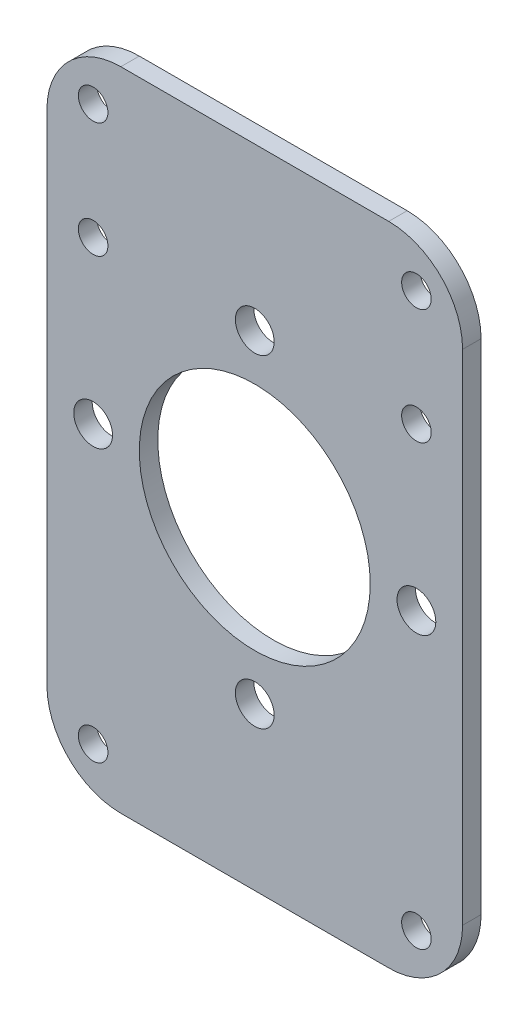
ISO-10303-21;
HEADER;
FILE_DESCRIPTION(('STEP AP214'),'2;1');
FILE_NAME('part.step','',(''),(''),'','','');
FILE_SCHEMA(('AUTOMOTIVE_DESIGN { 1 0 10303 214 1 1 1 1 }'));
ENDSEC;
DATA;
#1=APPLICATION_CONTEXT('core data for automotive mechanical design processes');
#2=APPLICATION_PROTOCOL_DEFINITION('international standard','automotive_design',2000,#1);
#3=PRODUCT_CONTEXT('',#1,'mechanical');
#4=PRODUCT('Part','Part','',(#3));
#5=PRODUCT_RELATED_PRODUCT_CATEGORY('part','',(#4));
#6=PRODUCT_DEFINITION_FORMATION('','',#4);
#7=PRODUCT_DEFINITION_CONTEXT('part definition',#1,'design');
#8=PRODUCT_DEFINITION('design','',#6,#7);
#9=PRODUCT_DEFINITION_SHAPE('','',#8);
#10=(LENGTH_UNIT() NAMED_UNIT(*) SI_UNIT(.MILLI.,.METRE.));
#11=(NAMED_UNIT(*) PLANE_ANGLE_UNIT() SI_UNIT($,.RADIAN.));
#12=(NAMED_UNIT(*) SI_UNIT($,.STERADIAN.) SOLID_ANGLE_UNIT());
#13=UNCERTAINTY_MEASURE_WITH_UNIT(LENGTH_MEASURE(1.E-05),#10,'distance_accuracy_value','');
#14=(GEOMETRIC_REPRESENTATION_CONTEXT(3) GLOBAL_UNCERTAINTY_ASSIGNED_CONTEXT((#13)) GLOBAL_UNIT_ASSIGNED_CONTEXT((#10,
#11,#12)) REPRESENTATION_CONTEXT('',''));
#15=CARTESIAN_POINT('',(0.,0.,0.));
#16=DIRECTION('',(0.,0.,1.));
#17=DIRECTION('',(1.,0.,0.));
#18=AXIS2_PLACEMENT_3D('',#15,#16,#17);
#19=CARTESIAN_POINT('',(0.,0.,2.));
#20=DIRECTION('',(0.,0.,1.));
#21=DIRECTION('',(1.,0.,0.));
#22=AXIS2_PLACEMENT_3D('',#19,#20,#21);
#23=PLANE('',#22);
#24=CARTESIAN_POINT('',(-17.5,-30.,2.));
#25=DIRECTION('',(0.,0.,1.));
#26=DIRECTION('',(1.,0.,0.));
#27=AXIS2_PLACEMENT_3D('',#24,#25,#26);
#28=CIRCLE('',#27,1.6);
#29=CARTESIAN_POINT('',(-15.9,-30.,2.));
#30=VERTEX_POINT('',#29);
#31=EDGE_CURVE('E228',#30,#30,#28,.T.);
#32=ORIENTED_EDGE('',*,*,#31,.F.);
#33=EDGE_LOOP('',(#32));
#34=FACE_BOUND('',#33,.T.);
#35=CARTESIAN_POINT('',(-17.5,30.,2.));
#36=DIRECTION('',(0.,0.,1.));
#37=DIRECTION('',(1.,0.,0.));
#38=AXIS2_PLACEMENT_3D('',#35,#36,#37);
#39=CIRCLE('',#38,1.6);
#40=CARTESIAN_POINT('',(-15.9,30.,2.));
#41=VERTEX_POINT('',#40);
#42=EDGE_CURVE('E216',#41,#41,#39,.T.);
#43=ORIENTED_EDGE('',*,*,#42,.F.);
#44=EDGE_LOOP('',(#43));
#45=FACE_BOUND('',#44,.T.);
#46=CARTESIAN_POINT('',(-17.5,17.5,2.));
#47=DIRECTION('',(0.,0.,1.));
#48=DIRECTION('',(1.,0.,0.));
#49=AXIS2_PLACEMENT_3D('',#46,#47,#48);
#50=CIRCLE('',#49,1.6);
#51=CARTESIAN_POINT('',(-15.9,17.5,2.));
#52=VERTEX_POINT('',#51);
#53=EDGE_CURVE('E204',#52,#52,#50,.T.);
#54=ORIENTED_EDGE('',*,*,#53,.F.);
#55=EDGE_LOOP('',(#54));
#56=FACE_BOUND('',#55,.T.);
#57=CARTESIAN_POINT('',(0.,-17.5,2.));
#58=DIRECTION('',(0.,0.,1.));
#59=DIRECTION('',(1.,0.,0.));
#60=AXIS2_PLACEMENT_3D('',#57,#58,#59);
#61=CIRCLE('',#60,2.1);
#62=CARTESIAN_POINT('',(2.1,-17.5,2.));
#63=VERTEX_POINT('',#62);
#64=EDGE_CURVE('E192',#63,#63,#61,.T.);
#65=ORIENTED_EDGE('',*,*,#64,.F.);
#66=EDGE_LOOP('',(#65));
#67=FACE_BOUND('',#66,.T.);
#68=CARTESIAN_POINT('',(-17.5,0.,2.));
#69=DIRECTION('',(0.,0.,1.));
#70=DIRECTION('',(1.,0.,0.));
#71=AXIS2_PLACEMENT_3D('',#68,#69,#70);
#72=CIRCLE('',#71,2.1);
#73=CARTESIAN_POINT('',(-15.4,0.,2.));
#74=VERTEX_POINT('',#73);
#75=EDGE_CURVE('E180',#74,#74,#72,.T.);
#76=ORIENTED_EDGE('',*,*,#75,.F.);
#77=EDGE_LOOP('',(#76));
#78=FACE_BOUND('',#77,.T.);
#79=DIRECTION('',(0.,-1.,0.));
#80=VECTOR('',#79,1.);
#81=CARTESIAN_POINT('',(-22.5,-35.,2.));
#82=LINE('',#81,#80);
#83=CARTESIAN_POINT('',(-22.5,27.,2.));
#84=VERTEX_POINT('',#83);
#85=CARTESIAN_POINT('',(-22.5,-27.,2.));
#86=VERTEX_POINT('',#85);
#87=EDGE_CURVE('E137',#84,#86,#82,.T.);
#88=ORIENTED_EDGE('',*,*,#87,.T.);
#89=CARTESIAN_POINT('',(-14.5,-27.,2.));
#90=DIRECTION('',(0.,0.,1.));
#91=DIRECTION('',(1.,0.,0.));
#92=AXIS2_PLACEMENT_3D('',#89,#90,#91);
#93=CIRCLE('',#92,8.);
#94=CARTESIAN_POINT('',(-14.5,-35.,2.));
#95=VERTEX_POINT('',#94);
#96=EDGE_CURVE('E152',#86,#95,#93,.T.);
#97=ORIENTED_EDGE('',*,*,#96,.T.);
#98=DIRECTION('',(1.,0.,0.));
#99=VECTOR('',#98,1.);
#100=CARTESIAN_POINT('',(22.5,-35.,2.));
#101=LINE('',#100,#99);
#102=CARTESIAN_POINT('',(14.5,-35.,2.));
#103=VERTEX_POINT('',#102);
#104=EDGE_CURVE('E119',#95,#103,#101,.T.);
#105=ORIENTED_EDGE('',*,*,#104,.T.);
#106=CARTESIAN_POINT('',(14.5,-27.,2.));
#107=DIRECTION('',(0.,0.,1.));
#108=DIRECTION('',(1.,0.,0.));
#109=AXIS2_PLACEMENT_3D('',#106,#107,#108);
#110=CIRCLE('',#109,8.);
#111=CARTESIAN_POINT('',(22.5,-27.,2.));
#112=VERTEX_POINT('',#111);
#113=EDGE_CURVE('E150',#103,#112,#110,.T.);
#114=ORIENTED_EDGE('',*,*,#113,.T.);
#115=DIRECTION('',(0.,1.,0.));
#116=VECTOR('',#115,1.);
#117=CARTESIAN_POINT('',(22.5,-35.,2.));
#118=LINE('',#117,#116);
#119=CARTESIAN_POINT('',(22.5,27.,2.));
#120=VERTEX_POINT('',#119);
#121=EDGE_CURVE('E163',#112,#120,#118,.T.);
#122=ORIENTED_EDGE('',*,*,#121,.T.);
#123=CARTESIAN_POINT('',(14.5,27.,2.));
#124=DIRECTION('',(0.,0.,1.));
#125=DIRECTION('',(1.,0.,0.));
#126=AXIS2_PLACEMENT_3D('',#123,#124,#125);
#127=CIRCLE('',#126,8.);
#128=CARTESIAN_POINT('',(14.5,35.,2.));
#129=VERTEX_POINT('',#128);
#130=EDGE_CURVE('E54',#120,#129,#127,.T.);
#131=ORIENTED_EDGE('',*,*,#130,.T.);
#132=DIRECTION('',(-1.,0.,0.));
#133=VECTOR('',#132,1.);
#134=CARTESIAN_POINT('',(22.5,35.,2.));
#135=LINE('',#134,#133);
#136=CARTESIAN_POINT('',(-14.5,35.,2.));
#137=VERTEX_POINT('',#136);
#138=EDGE_CURVE('E138',#129,#137,#135,.T.);
#139=ORIENTED_EDGE('',*,*,#138,.T.);
#140=CARTESIAN_POINT('',(-14.5,27.,2.));
#141=DIRECTION('',(0.,0.,1.));
#142=DIRECTION('',(1.,0.,0.));
#143=AXIS2_PLACEMENT_3D('',#140,#141,#142);
#144=CIRCLE('',#143,8.);
#145=EDGE_CURVE('E147',#137,#84,#144,.T.);
#146=ORIENTED_EDGE('',*,*,#145,.T.);
#147=EDGE_LOOP('',(#88,#97,#105,#114,#122,#131,#139,#146));
#148=FACE_BOUND('',#147,.T.);
#149=CARTESIAN_POINT('',(0.,17.5,2.));
#150=DIRECTION('',(0.,0.,1.));
#151=DIRECTION('',(1.,0.,0.));
#152=AXIS2_PLACEMENT_3D('',#149,#150,#151);
#153=CIRCLE('',#152,2.1);
#154=CARTESIAN_POINT('',(2.1,17.5,2.));
#155=VERTEX_POINT('',#154);
#156=EDGE_CURVE('E132',#155,#155,#153,.T.);
#157=ORIENTED_EDGE('',*,*,#156,.F.);
#158=EDGE_LOOP('',(#157));
#159=FACE_BOUND('',#158,.T.);
#160=CARTESIAN_POINT('',(17.5,0.,2.));
#161=DIRECTION('',(0.,0.,1.));
#162=DIRECTION('',(1.,0.,0.));
#163=AXIS2_PLACEMENT_3D('',#160,#161,#162);
#164=CIRCLE('',#163,2.1);
#165=CARTESIAN_POINT('',(19.6,0.,2.));
#166=VERTEX_POINT('',#165);
#167=EDGE_CURVE('E186',#166,#166,#164,.T.);
#168=ORIENTED_EDGE('',*,*,#167,.F.);
#169=EDGE_LOOP('',(#168));
#170=FACE_BOUND('',#169,.T.);
#171=CARTESIAN_POINT('',(0.,0.,2.));
#172=DIRECTION('',(0.,0.,1.));
#173=DIRECTION('',(1.,0.,0.));
#174=AXIS2_PLACEMENT_3D('',#171,#172,#173);
#175=CIRCLE('',#174,12.5);
#176=CARTESIAN_POINT('',(12.5,0.,2.));
#177=VERTEX_POINT('',#176);
#178=EDGE_CURVE('E198',#177,#177,#175,.T.);
#179=ORIENTED_EDGE('',*,*,#178,.F.);
#180=EDGE_LOOP('',(#179));
#181=FACE_BOUND('',#180,.T.);
#182=CARTESIAN_POINT('',(17.5,17.5,2.));
#183=DIRECTION('',(0.,0.,1.));
#184=DIRECTION('',(1.,0.,0.));
#185=AXIS2_PLACEMENT_3D('',#182,#183,#184);
#186=CIRCLE('',#185,1.6);
#187=CARTESIAN_POINT('',(19.1,17.5,2.));
#188=VERTEX_POINT('',#187);
#189=EDGE_CURVE('E210',#188,#188,#186,.T.);
#190=ORIENTED_EDGE('',*,*,#189,.F.);
#191=EDGE_LOOP('',(#190));
#192=FACE_BOUND('',#191,.T.);
#193=CARTESIAN_POINT('',(17.5,30.,2.));
#194=DIRECTION('',(0.,0.,1.));
#195=DIRECTION('',(1.,0.,0.));
#196=AXIS2_PLACEMENT_3D('',#193,#194,#195);
#197=CIRCLE('',#196,1.6);
#198=CARTESIAN_POINT('',(19.1,30.,2.));
#199=VERTEX_POINT('',#198);
#200=EDGE_CURVE('E222',#199,#199,#197,.T.);
#201=ORIENTED_EDGE('',*,*,#200,.F.);
#202=EDGE_LOOP('',(#201));
#203=FACE_BOUND('',#202,.T.);
#204=CARTESIAN_POINT('',(17.5,-30.,2.));
#205=DIRECTION('',(0.,0.,1.));
#206=DIRECTION('',(1.,0.,0.));
#207=AXIS2_PLACEMENT_3D('',#204,#205,#206);
#208=CIRCLE('',#207,1.6);
#209=CARTESIAN_POINT('',(19.1,-30.,2.));
#210=VERTEX_POINT('',#209);
#211=EDGE_CURVE('E234',#210,#210,#208,.T.);
#212=ORIENTED_EDGE('',*,*,#211,.F.);
#213=EDGE_LOOP('',(#212));
#214=FACE_BOUND('',#213,.T.);
#215=ADVANCED_FACE('F33',(#34,#45,#56,#67,#78,#148,#159,#170,#181,#192,#203,#214),#23,.T.);
#216=CARTESIAN_POINT('',(0.,0.,0.));
#217=DIRECTION('',(0.,0.,1.));
#218=DIRECTION('',(1.,0.,0.));
#219=AXIS2_PLACEMENT_3D('',#216,#217,#218);
#220=PLANE('',#219);
#221=DIRECTION('',(1.,0.,0.));
#222=VECTOR('',#221,1.);
#223=CARTESIAN_POINT('',(22.5,-35.,0.));
#224=LINE('',#223,#222);
#225=CARTESIAN_POINT('',(-14.5,-35.,0.));
#226=VERTEX_POINT('',#225);
#227=CARTESIAN_POINT('',(14.5,-35.,0.));
#228=VERTEX_POINT('',#227);
#229=EDGE_CURVE('E116',#226,#228,#224,.T.);
#230=ORIENTED_EDGE('',*,*,#229,.F.);
#231=CARTESIAN_POINT('',(-14.5,-27.,0.));
#232=DIRECTION('',(0.,0.,1.));
#233=DIRECTION('',(1.,0.,0.));
#234=AXIS2_PLACEMENT_3D('',#231,#232,#233);
#235=CIRCLE('',#234,8.);
#236=CARTESIAN_POINT('',(-22.5,-27.,0.));
#237=VERTEX_POINT('',#236);
#238=EDGE_CURVE('E99',#226,#237,#235,.F.);
#239=ORIENTED_EDGE('',*,*,#238,.T.);
#240=DIRECTION('',(0.,-1.,0.));
#241=VECTOR('',#240,1.);
#242=CARTESIAN_POINT('',(-22.5,-35.,0.));
#243=LINE('',#242,#241);
#244=CARTESIAN_POINT('',(-22.5,27.,0.));
#245=VERTEX_POINT('',#244);
#246=EDGE_CURVE('E127',#245,#237,#243,.T.);
#247=ORIENTED_EDGE('',*,*,#246,.F.);
#248=CARTESIAN_POINT('',(-14.5,27.,0.));
#249=DIRECTION('',(0.,0.,1.));
#250=DIRECTION('',(1.,0.,0.));
#251=AXIS2_PLACEMENT_3D('',#248,#249,#250);
#252=CIRCLE('',#251,8.);
#253=CARTESIAN_POINT('',(-14.5,35.,0.));
#254=VERTEX_POINT('',#253);
#255=EDGE_CURVE('E120',#245,#254,#252,.F.);
#256=ORIENTED_EDGE('',*,*,#255,.T.);
#257=DIRECTION('',(-1.,0.,0.));
#258=VECTOR('',#257,1.);
#259=CARTESIAN_POINT('',(22.5,35.,0.));
#260=LINE('',#259,#258);
#261=CARTESIAN_POINT('',(14.5,35.,0.));
#262=VERTEX_POINT('',#261);
#263=EDGE_CURVE('E130',#262,#254,#260,.T.);
#264=ORIENTED_EDGE('',*,*,#263,.F.);
#265=CARTESIAN_POINT('',(14.5,27.,0.));
#266=DIRECTION('',(0.,0.,1.));
#267=DIRECTION('',(1.,0.,0.));
#268=AXIS2_PLACEMENT_3D('',#265,#266,#267);
#269=CIRCLE('',#268,8.);
#270=CARTESIAN_POINT('',(22.5,27.,0.));
#271=VERTEX_POINT('',#270);
#272=EDGE_CURVE('E141',#262,#271,#269,.F.);
#273=ORIENTED_EDGE('',*,*,#272,.T.);
#274=DIRECTION('',(0.,1.,0.));
#275=VECTOR('',#274,1.);
#276=CARTESIAN_POINT('',(22.5,-35.,0.));
#277=LINE('',#276,#275);
#278=CARTESIAN_POINT('',(22.5,-27.,0.));
#279=VERTEX_POINT('',#278);
#280=EDGE_CURVE('E126',#279,#271,#277,.T.);
#281=ORIENTED_EDGE('',*,*,#280,.F.);
#282=CARTESIAN_POINT('',(14.5,-27.,0.));
#283=DIRECTION('',(0.,0.,1.));
#284=DIRECTION('',(1.,0.,0.));
#285=AXIS2_PLACEMENT_3D('',#282,#283,#284);
#286=CIRCLE('',#285,8.);
#287=EDGE_CURVE('E110',#279,#228,#286,.F.);
#288=ORIENTED_EDGE('',*,*,#287,.T.);
#289=EDGE_LOOP('',(#230,#239,#247,#256,#264,#273,#281,#288));
#290=FACE_BOUND('',#289,.T.);
#291=CARTESIAN_POINT('',(0.,17.5,0.));
#292=DIRECTION('',(0.,0.,1.));
#293=DIRECTION('',(1.,0.,0.));
#294=AXIS2_PLACEMENT_3D('',#291,#292,#293);
#295=CIRCLE('',#294,2.1);
#296=CARTESIAN_POINT('',(2.1,17.5,0.));
#297=VERTEX_POINT('',#296);
#298=EDGE_CURVE('E177',#297,#297,#295,.T.);
#299=ORIENTED_EDGE('',*,*,#298,.T.);
#300=EDGE_LOOP('',(#299));
#301=FACE_BOUND('',#300,.T.);
#302=CARTESIAN_POINT('',(-17.5,0.,0.));
#303=DIRECTION('',(0.,0.,1.));
#304=DIRECTION('',(1.,0.,0.));
#305=AXIS2_PLACEMENT_3D('',#302,#303,#304);
#306=CIRCLE('',#305,2.1);
#307=CARTESIAN_POINT('',(-15.4,0.,0.));
#308=VERTEX_POINT('',#307);
#309=EDGE_CURVE('E183',#308,#308,#306,.T.);
#310=ORIENTED_EDGE('',*,*,#309,.T.);
#311=EDGE_LOOP('',(#310));
#312=FACE_BOUND('',#311,.T.);
#313=CARTESIAN_POINT('',(17.5,0.,0.));
#314=DIRECTION('',(0.,0.,1.));
#315=DIRECTION('',(1.,0.,0.));
#316=AXIS2_PLACEMENT_3D('',#313,#314,#315);
#317=CIRCLE('',#316,2.1);
#318=CARTESIAN_POINT('',(19.6,0.,0.));
#319=VERTEX_POINT('',#318);
#320=EDGE_CURVE('E189',#319,#319,#317,.T.);
#321=ORIENTED_EDGE('',*,*,#320,.T.);
#322=EDGE_LOOP('',(#321));
#323=FACE_BOUND('',#322,.T.);
#324=CARTESIAN_POINT('',(0.,-17.5,0.));
#325=DIRECTION('',(0.,0.,1.));
#326=DIRECTION('',(1.,0.,0.));
#327=AXIS2_PLACEMENT_3D('',#324,#325,#326);
#328=CIRCLE('',#327,2.1);
#329=CARTESIAN_POINT('',(2.1,-17.5,0.));
#330=VERTEX_POINT('',#329);
#331=EDGE_CURVE('E195',#330,#330,#328,.T.);
#332=ORIENTED_EDGE('',*,*,#331,.T.);
#333=EDGE_LOOP('',(#332));
#334=FACE_BOUND('',#333,.T.);
#335=CARTESIAN_POINT('',(0.,0.,0.));
#336=DIRECTION('',(0.,0.,1.));
#337=DIRECTION('',(1.,0.,0.));
#338=AXIS2_PLACEMENT_3D('',#335,#336,#337);
#339=CIRCLE('',#338,12.5);
#340=CARTESIAN_POINT('',(12.5,0.,0.));
#341=VERTEX_POINT('',#340);
#342=EDGE_CURVE('E201',#341,#341,#339,.T.);
#343=ORIENTED_EDGE('',*,*,#342,.T.);
#344=EDGE_LOOP('',(#343));
#345=FACE_BOUND('',#344,.T.);
#346=CARTESIAN_POINT('',(-17.5,17.5,0.));
#347=DIRECTION('',(0.,0.,1.));
#348=DIRECTION('',(1.,0.,0.));
#349=AXIS2_PLACEMENT_3D('',#346,#347,#348);
#350=CIRCLE('',#349,1.6);
#351=CARTESIAN_POINT('',(-15.9,17.5,0.));
#352=VERTEX_POINT('',#351);
#353=EDGE_CURVE('E207',#352,#352,#350,.T.);
#354=ORIENTED_EDGE('',*,*,#353,.T.);
#355=EDGE_LOOP('',(#354));
#356=FACE_BOUND('',#355,.T.);
#357=CARTESIAN_POINT('',(17.5,17.5,0.));
#358=DIRECTION('',(0.,0.,1.));
#359=DIRECTION('',(1.,0.,0.));
#360=AXIS2_PLACEMENT_3D('',#357,#358,#359);
#361=CIRCLE('',#360,1.6);
#362=CARTESIAN_POINT('',(19.1,17.5,0.));
#363=VERTEX_POINT('',#362);
#364=EDGE_CURVE('E213',#363,#363,#361,.T.);
#365=ORIENTED_EDGE('',*,*,#364,.T.);
#366=EDGE_LOOP('',(#365));
#367=FACE_BOUND('',#366,.T.);
#368=CARTESIAN_POINT('',(-17.5,30.,0.));
#369=DIRECTION('',(0.,0.,1.));
#370=DIRECTION('',(1.,0.,0.));
#371=AXIS2_PLACEMENT_3D('',#368,#369,#370);
#372=CIRCLE('',#371,1.6);
#373=CARTESIAN_POINT('',(-15.9,30.,0.));
#374=VERTEX_POINT('',#373);
#375=EDGE_CURVE('E219',#374,#374,#372,.T.);
#376=ORIENTED_EDGE('',*,*,#375,.T.);
#377=EDGE_LOOP('',(#376));
#378=FACE_BOUND('',#377,.T.);
#379=CARTESIAN_POINT('',(17.5,30.,0.));
#380=DIRECTION('',(0.,0.,1.));
#381=DIRECTION('',(1.,0.,0.));
#382=AXIS2_PLACEMENT_3D('',#379,#380,#381);
#383=CIRCLE('',#382,1.6);
#384=CARTESIAN_POINT('',(19.1,30.,0.));
#385=VERTEX_POINT('',#384);
#386=EDGE_CURVE('E225',#385,#385,#383,.T.);
#387=ORIENTED_EDGE('',*,*,#386,.T.);
#388=EDGE_LOOP('',(#387));
#389=FACE_BOUND('',#388,.T.);
#390=CARTESIAN_POINT('',(-17.5,-30.,0.));
#391=DIRECTION('',(0.,0.,1.));
#392=DIRECTION('',(1.,0.,0.));
#393=AXIS2_PLACEMENT_3D('',#390,#391,#392);
#394=CIRCLE('',#393,1.6);
#395=CARTESIAN_POINT('',(-15.9,-30.,0.));
#396=VERTEX_POINT('',#395);
#397=EDGE_CURVE('E231',#396,#396,#394,.T.);
#398=ORIENTED_EDGE('',*,*,#397,.T.);
#399=EDGE_LOOP('',(#398));
#400=FACE_BOUND('',#399,.T.);
#401=CARTESIAN_POINT('',(17.5,-30.,0.));
#402=DIRECTION('',(0.,0.,1.));
#403=DIRECTION('',(1.,0.,0.));
#404=AXIS2_PLACEMENT_3D('',#401,#402,#403);
#405=CIRCLE('',#404,1.6);
#406=CARTESIAN_POINT('',(19.1,-30.,0.));
#407=VERTEX_POINT('',#406);
#408=EDGE_CURVE('E237',#407,#407,#405,.T.);
#409=ORIENTED_EDGE('',*,*,#408,.T.);
#410=EDGE_LOOP('',(#409));
#411=FACE_BOUND('',#410,.T.);
#412=ADVANCED_FACE('F123',(#290,#301,#312,#323,#334,#345,#356,#367,#378,#389,#400,#411),#220,.F.);
#413=CARTESIAN_POINT('',(-22.5,-35.,2.));
#414=DIRECTION('',(1.,0.,0.));
#415=DIRECTION('',(0.,0.,-1.));
#416=AXIS2_PLACEMENT_3D('',#413,#414,#415);
#417=PLANE('',#416);
#418=ORIENTED_EDGE('',*,*,#246,.T.);
#419=DIRECTION('',(0.,0.,-1.));
#420=VECTOR('',#419,1.);
#421=CARTESIAN_POINT('',(-22.5,-27.,2.));
#422=LINE('',#421,#420);
#423=EDGE_CURVE('E104',#237,#86,#422,.F.);
#424=ORIENTED_EDGE('',*,*,#423,.T.);
#425=ORIENTED_EDGE('',*,*,#87,.F.);
#426=DIRECTION('',(0.,0.,-1.));
#427=VECTOR('',#426,1.);
#428=CARTESIAN_POINT('',(-22.5,27.,2.));
#429=LINE('',#428,#427);
#430=EDGE_CURVE('E109',#84,#245,#429,.T.);
#431=ORIENTED_EDGE('',*,*,#430,.T.);
#432=EDGE_LOOP('',(#418,#424,#425,#431));
#433=FACE_BOUND('',#432,.T.);
#434=ADVANCED_FACE('F252',(#433),#417,.F.);
#435=CARTESIAN_POINT('',(22.5,-35.,2.));
#436=DIRECTION('',(0.,1.,0.));
#437=DIRECTION('',(-1.,0.,0.));
#438=AXIS2_PLACEMENT_3D('',#435,#436,#437);
#439=PLANE('',#438);
#440=ORIENTED_EDGE('',*,*,#104,.F.);
#441=DIRECTION('',(0.,0.,-1.));
#442=VECTOR('',#441,1.);
#443=CARTESIAN_POINT('',(-14.5,-35.,2.));
#444=LINE('',#443,#442);
#445=EDGE_CURVE('E103',#95,#226,#444,.T.);
#446=ORIENTED_EDGE('',*,*,#445,.T.);
#447=ORIENTED_EDGE('',*,*,#229,.T.);
#448=DIRECTION('',(0.,0.,-1.));
#449=VECTOR('',#448,1.);
#450=CARTESIAN_POINT('',(14.5,-35.,2.));
#451=LINE('',#450,#449);
#452=EDGE_CURVE('E121',#228,#103,#451,.F.);
#453=ORIENTED_EDGE('',*,*,#452,.T.);
#454=EDGE_LOOP('',(#440,#446,#447,#453));
#455=FACE_BOUND('',#454,.T.);
#456=ADVANCED_FACE('F115',(#455),#439,.F.);
#457=CARTESIAN_POINT('',(22.5,-35.,2.));
#458=DIRECTION('',(-1.,0.,0.));
#459=DIRECTION('',(0.,0.,1.));
#460=AXIS2_PLACEMENT_3D('',#457,#458,#459);
#461=PLANE('',#460);
#462=ORIENTED_EDGE('',*,*,#121,.F.);
#463=DIRECTION('',(0.,0.,-1.));
#464=VECTOR('',#463,1.);
#465=CARTESIAN_POINT('',(22.5,-27.,2.));
#466=LINE('',#465,#464);
#467=EDGE_CURVE('E156',#112,#279,#466,.T.);
#468=ORIENTED_EDGE('',*,*,#467,.T.);
#469=ORIENTED_EDGE('',*,*,#280,.T.);
#470=DIRECTION('',(0.,0.,-1.));
#471=VECTOR('',#470,1.);
#472=CARTESIAN_POINT('',(22.5,27.,2.));
#473=LINE('',#472,#471);
#474=EDGE_CURVE('E154',#271,#120,#473,.F.);
#475=ORIENTED_EDGE('',*,*,#474,.T.);
#476=EDGE_LOOP('',(#462,#468,#469,#475));
#477=FACE_BOUND('',#476,.T.);
#478=ADVANCED_FACE('F161',(#477),#461,.F.);
#479=CARTESIAN_POINT('',(22.5,35.,2.));
#480=DIRECTION('',(0.,-1.,0.));
#481=DIRECTION('',(1.,0.,0.));
#482=AXIS2_PLACEMENT_3D('',#479,#480,#481);
#483=PLANE('',#482);
#484=ORIENTED_EDGE('',*,*,#138,.F.);
#485=DIRECTION('',(0.,0.,-1.));
#486=VECTOR('',#485,1.);
#487=CARTESIAN_POINT('',(14.5,35.,2.));
#488=LINE('',#487,#486);
#489=EDGE_CURVE('E11',#129,#262,#488,.T.);
#490=ORIENTED_EDGE('',*,*,#489,.T.);
#491=ORIENTED_EDGE('',*,*,#263,.T.);
#492=DIRECTION('',(0.,0.,-1.));
#493=VECTOR('',#492,1.);
#494=CARTESIAN_POINT('',(-14.5,35.,2.));
#495=LINE('',#494,#493);
#496=EDGE_CURVE('E41',#254,#137,#495,.F.);
#497=ORIENTED_EDGE('',*,*,#496,.T.);
#498=EDGE_LOOP('',(#484,#490,#491,#497));
#499=FACE_BOUND('',#498,.T.);
#500=ADVANCED_FACE('F170',(#499),#483,.F.);
#501=CARTESIAN_POINT('',(0.,17.5,2.));
#502=DIRECTION('',(0.,0.,-1.));
#503=DIRECTION('',(-1.,0.,0.));
#504=AXIS2_PLACEMENT_3D('',#501,#502,#503);
#505=CYLINDRICAL_SURFACE('',#504,2.1);
#506=ORIENTED_EDGE('',*,*,#156,.T.);
#507=EDGE_LOOP('',(#506));
#508=FACE_BOUND('',#507,.T.);
#509=ORIENTED_EDGE('',*,*,#298,.F.);
#510=EDGE_LOOP('',(#509));
#511=FACE_BOUND('',#510,.T.);
#512=ADVANCED_FACE('F257',(#508,#511),#505,.F.);
#513=CARTESIAN_POINT('',(-17.5,0.,2.));
#514=DIRECTION('',(0.,0.,-1.));
#515=DIRECTION('',(-1.,0.,0.));
#516=AXIS2_PLACEMENT_3D('',#513,#514,#515);
#517=CYLINDRICAL_SURFACE('',#516,2.1);
#518=ORIENTED_EDGE('',*,*,#75,.T.);
#519=EDGE_LOOP('',(#518));
#520=FACE_BOUND('',#519,.T.);
#521=ORIENTED_EDGE('',*,*,#309,.F.);
#522=EDGE_LOOP('',(#521));
#523=FACE_BOUND('',#522,.T.);
#524=ADVANCED_FACE('F334',(#520,#523),#517,.F.);
#525=CARTESIAN_POINT('',(17.5,0.,2.));
#526=DIRECTION('',(0.,0.,-1.));
#527=DIRECTION('',(-1.,0.,0.));
#528=AXIS2_PLACEMENT_3D('',#525,#526,#527);
#529=CYLINDRICAL_SURFACE('',#528,2.1);
#530=ORIENTED_EDGE('',*,*,#167,.T.);
#531=EDGE_LOOP('',(#530));
#532=FACE_BOUND('',#531,.T.);
#533=ORIENTED_EDGE('',*,*,#320,.F.);
#534=EDGE_LOOP('',(#533));
#535=FACE_BOUND('',#534,.T.);
#536=ADVANCED_FACE('F331',(#532,#535),#529,.F.);
#537=CARTESIAN_POINT('',(0.,-17.5,2.));
#538=DIRECTION('',(0.,0.,-1.));
#539=DIRECTION('',(-1.,0.,0.));
#540=AXIS2_PLACEMENT_3D('',#537,#538,#539);
#541=CYLINDRICAL_SURFACE('',#540,2.1);
#542=ORIENTED_EDGE('',*,*,#64,.T.);
#543=EDGE_LOOP('',(#542));
#544=FACE_BOUND('',#543,.T.);
#545=ORIENTED_EDGE('',*,*,#331,.F.);
#546=EDGE_LOOP('',(#545));
#547=FACE_BOUND('',#546,.T.);
#548=ADVANCED_FACE('F327',(#544,#547),#541,.F.);
#549=CARTESIAN_POINT('',(0.,0.,2.));
#550=DIRECTION('',(0.,0.,-1.));
#551=DIRECTION('',(-1.,0.,0.));
#552=AXIS2_PLACEMENT_3D('',#549,#550,#551);
#553=CYLINDRICAL_SURFACE('',#552,12.5);
#554=ORIENTED_EDGE('',*,*,#178,.T.);
#555=EDGE_LOOP('',(#554));
#556=FACE_BOUND('',#555,.T.);
#557=ORIENTED_EDGE('',*,*,#342,.F.);
#558=EDGE_LOOP('',(#557));
#559=FACE_BOUND('',#558,.T.);
#560=ADVANCED_FACE('F323',(#556,#559),#553,.F.);
#561=CARTESIAN_POINT('',(-17.5,17.5,2.));
#562=DIRECTION('',(0.,0.,-1.));
#563=DIRECTION('',(-1.,0.,0.));
#564=AXIS2_PLACEMENT_3D('',#561,#562,#563);
#565=CYLINDRICAL_SURFACE('',#564,1.6);
#566=ORIENTED_EDGE('',*,*,#53,.T.);
#567=EDGE_LOOP('',(#566));
#568=FACE_BOUND('',#567,.T.);
#569=ORIENTED_EDGE('',*,*,#353,.F.);
#570=EDGE_LOOP('',(#569));
#571=FACE_BOUND('',#570,.T.);
#572=ADVANCED_FACE('F319',(#568,#571),#565,.F.);
#573=CARTESIAN_POINT('',(17.5,17.5,2.));
#574=DIRECTION('',(0.,0.,-1.));
#575=DIRECTION('',(-1.,0.,0.));
#576=AXIS2_PLACEMENT_3D('',#573,#574,#575);
#577=CYLINDRICAL_SURFACE('',#576,1.6);
#578=ORIENTED_EDGE('',*,*,#189,.T.);
#579=EDGE_LOOP('',(#578));
#580=FACE_BOUND('',#579,.T.);
#581=ORIENTED_EDGE('',*,*,#364,.F.);
#582=EDGE_LOOP('',(#581));
#583=FACE_BOUND('',#582,.T.);
#584=ADVANCED_FACE('F315',(#580,#583),#577,.F.);
#585=CARTESIAN_POINT('',(-17.5,30.,2.));
#586=DIRECTION('',(0.,0.,-1.));
#587=DIRECTION('',(-1.,0.,0.));
#588=AXIS2_PLACEMENT_3D('',#585,#586,#587);
#589=CYLINDRICAL_SURFACE('',#588,1.6);
#590=ORIENTED_EDGE('',*,*,#42,.T.);
#591=EDGE_LOOP('',(#590));
#592=FACE_BOUND('',#591,.T.);
#593=ORIENTED_EDGE('',*,*,#375,.F.);
#594=EDGE_LOOP('',(#593));
#595=FACE_BOUND('',#594,.T.);
#596=ADVANCED_FACE('F297',(#592,#595),#589,.F.);
#597=CARTESIAN_POINT('',(17.5,30.,2.));
#598=DIRECTION('',(0.,0.,-1.));
#599=DIRECTION('',(-1.,0.,0.));
#600=AXIS2_PLACEMENT_3D('',#597,#598,#599);
#601=CYLINDRICAL_SURFACE('',#600,1.6);
#602=ORIENTED_EDGE('',*,*,#200,.T.);
#603=EDGE_LOOP('',(#602));
#604=FACE_BOUND('',#603,.T.);
#605=ORIENTED_EDGE('',*,*,#386,.F.);
#606=EDGE_LOOP('',(#605));
#607=FACE_BOUND('',#606,.T.);
#608=ADVANCED_FACE('F293',(#604,#607),#601,.F.);
#609=CARTESIAN_POINT('',(-17.5,-30.,2.));
#610=DIRECTION('',(0.,0.,-1.));
#611=DIRECTION('',(-1.,0.,0.));
#612=AXIS2_PLACEMENT_3D('',#609,#610,#611);
#613=CYLINDRICAL_SURFACE('',#612,1.6);
#614=ORIENTED_EDGE('',*,*,#31,.T.);
#615=EDGE_LOOP('',(#614));
#616=FACE_BOUND('',#615,.T.);
#617=ORIENTED_EDGE('',*,*,#397,.F.);
#618=EDGE_LOOP('',(#617));
#619=FACE_BOUND('',#618,.T.);
#620=ADVANCED_FACE('F296',(#616,#619),#613,.F.);
#621=CARTESIAN_POINT('',(17.5,-30.,2.));
#622=DIRECTION('',(0.,0.,-1.));
#623=DIRECTION('',(-1.,0.,0.));
#624=AXIS2_PLACEMENT_3D('',#621,#622,#623);
#625=CYLINDRICAL_SURFACE('',#624,1.6);
#626=ORIENTED_EDGE('',*,*,#211,.T.);
#627=EDGE_LOOP('',(#626));
#628=FACE_BOUND('',#627,.T.);
#629=ORIENTED_EDGE('',*,*,#408,.F.);
#630=EDGE_LOOP('',(#629));
#631=FACE_BOUND('',#630,.T.);
#632=ADVANCED_FACE('F243',(#628,#631),#625,.F.);
#633=CARTESIAN_POINT('',(-14.5,-27.,2.));
#634=DIRECTION('',(0.,0.,-1.));
#635=DIRECTION('',(-1.,0.,0.));
#636=AXIS2_PLACEMENT_3D('',#633,#634,#635);
#637=CYLINDRICAL_SURFACE('',#636,8.);
#638=ORIENTED_EDGE('',*,*,#96,.F.);
#639=ORIENTED_EDGE('',*,*,#423,.F.);
#640=ORIENTED_EDGE('',*,*,#238,.F.);
#641=ORIENTED_EDGE('',*,*,#445,.F.);
#642=EDGE_LOOP('',(#638,#639,#640,#641));
#643=FACE_BOUND('',#642,.T.);
#644=ADVANCED_FACE('F102',(#643),#637,.T.);
#645=CARTESIAN_POINT('',(14.5,-27.,2.));
#646=DIRECTION('',(0.,0.,-1.));
#647=DIRECTION('',(-1.,0.,0.));
#648=AXIS2_PLACEMENT_3D('',#645,#646,#647);
#649=CYLINDRICAL_SURFACE('',#648,8.);
#650=ORIENTED_EDGE('',*,*,#113,.F.);
#651=ORIENTED_EDGE('',*,*,#452,.F.);
#652=ORIENTED_EDGE('',*,*,#287,.F.);
#653=ORIENTED_EDGE('',*,*,#467,.F.);
#654=EDGE_LOOP('',(#650,#651,#652,#653));
#655=FACE_BOUND('',#654,.T.);
#656=ADVANCED_FACE('F271',(#655),#649,.T.);
#657=CARTESIAN_POINT('',(14.5,27.,2.));
#658=DIRECTION('',(0.,0.,-1.));
#659=DIRECTION('',(-1.,0.,0.));
#660=AXIS2_PLACEMENT_3D('',#657,#658,#659);
#661=CYLINDRICAL_SURFACE('',#660,8.);
#662=ORIENTED_EDGE('',*,*,#130,.F.);
#663=ORIENTED_EDGE('',*,*,#474,.F.);
#664=ORIENTED_EDGE('',*,*,#272,.F.);
#665=ORIENTED_EDGE('',*,*,#489,.F.);
#666=EDGE_LOOP('',(#662,#663,#664,#665));
#667=FACE_BOUND('',#666,.T.);
#668=ADVANCED_FACE('F169',(#667),#661,.T.);
#669=CARTESIAN_POINT('',(-14.5,27.,2.));
#670=DIRECTION('',(0.,0.,-1.));
#671=DIRECTION('',(-1.,0.,0.));
#672=AXIS2_PLACEMENT_3D('',#669,#670,#671);
#673=CYLINDRICAL_SURFACE('',#672,8.);
#674=ORIENTED_EDGE('',*,*,#145,.F.);
#675=ORIENTED_EDGE('',*,*,#496,.F.);
#676=ORIENTED_EDGE('',*,*,#255,.F.);
#677=ORIENTED_EDGE('',*,*,#430,.F.);
#678=EDGE_LOOP('',(#674,#675,#676,#677));
#679=FACE_BOUND('',#678,.T.);
#680=ADVANCED_FACE('F35',(#679),#673,.T.);
#681=CLOSED_SHELL('',(#215,#412,#434,#456,#478,#500,#512,#524,#536,#548,#560,#572,#584,#596,
#608,#620,#632,#644,#656,#668,#680));
#682=MANIFOLD_SOLID_BREP('B2',#681);
#683=ADVANCED_BREP_SHAPE_REPRESENTATION('',(#18,#682),#14);
#684=SHAPE_DEFINITION_REPRESENTATION(#9,#683);
ENDSEC;
END-ISO-10303-21;
